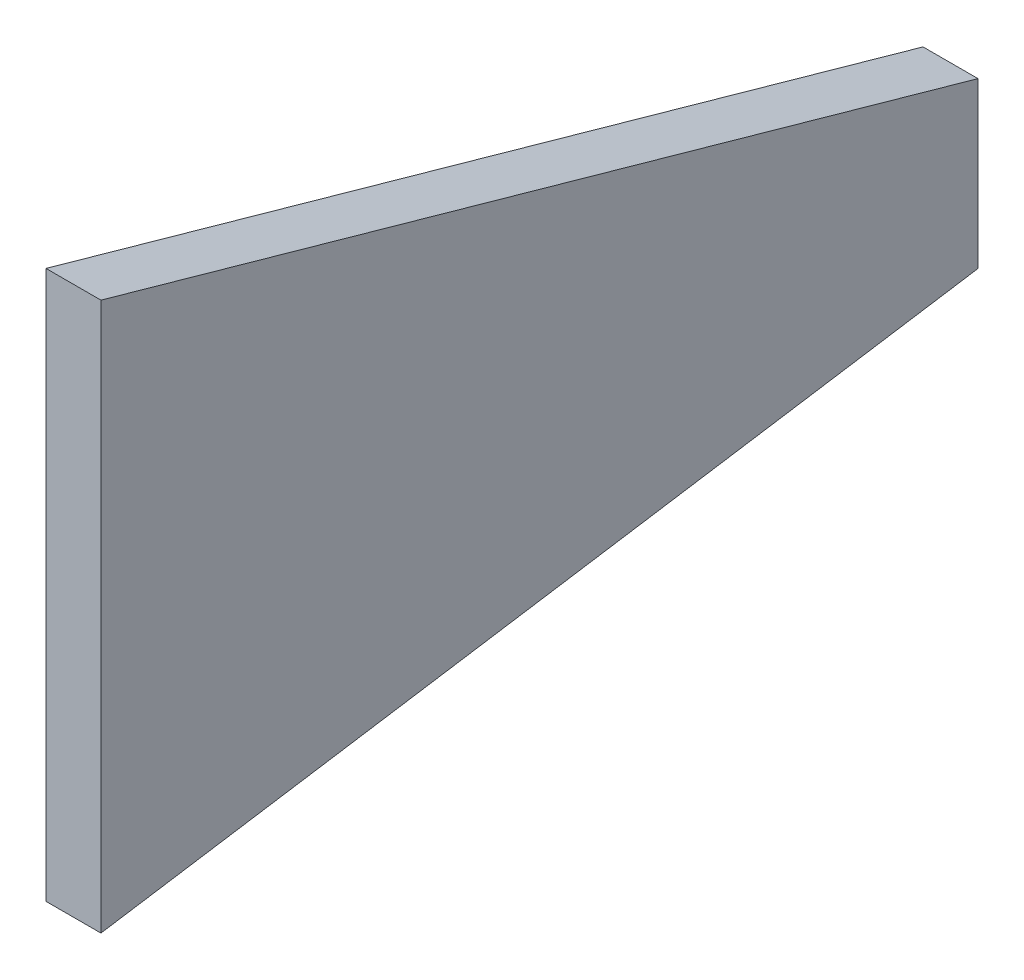
ISO-10303-21;
HEADER;
FILE_DESCRIPTION(('STEP AP214'),'2;1');
FILE_NAME('part.step','',(''),(''),'','','');
FILE_SCHEMA(('AUTOMOTIVE_DESIGN { 1 0 10303 214 1 1 1 1 }'));
ENDSEC;
DATA;
#1=APPLICATION_CONTEXT('core data for automotive mechanical design processes');
#2=APPLICATION_PROTOCOL_DEFINITION('international standard','automotive_design',2000,#1);
#3=PRODUCT_CONTEXT('',#1,'mechanical');
#4=PRODUCT('Part','Part','',(#3));
#5=PRODUCT_RELATED_PRODUCT_CATEGORY('part','',(#4));
#6=PRODUCT_DEFINITION_FORMATION('','',#4);
#7=PRODUCT_DEFINITION_CONTEXT('part definition',#1,'design');
#8=PRODUCT_DEFINITION('design','',#6,#7);
#9=PRODUCT_DEFINITION_SHAPE('','',#8);
#10=(LENGTH_UNIT() NAMED_UNIT(*) SI_UNIT(.MILLI.,.METRE.));
#11=(NAMED_UNIT(*) PLANE_ANGLE_UNIT() SI_UNIT($,.RADIAN.));
#12=(NAMED_UNIT(*) SI_UNIT($,.STERADIAN.) SOLID_ANGLE_UNIT());
#13=UNCERTAINTY_MEASURE_WITH_UNIT(LENGTH_MEASURE(1.E-05),#10,'distance_accuracy_value','');
#14=(GEOMETRIC_REPRESENTATION_CONTEXT(3) GLOBAL_UNCERTAINTY_ASSIGNED_CONTEXT((#13)) GLOBAL_UNIT_ASSIGNED_CONTEXT((#10,
#11,#12)) REPRESENTATION_CONTEXT('',''));
#15=CARTESIAN_POINT('',(0.,0.,0.));
#16=DIRECTION('',(0.,0.,1.));
#17=DIRECTION('',(1.,0.,0.));
#18=AXIS2_PLACEMENT_3D('',#15,#16,#17);
#19=CARTESIAN_POINT('',(-10.,100.,150.));
#20=DIRECTION('',(-0.997785157856609,0.,-0.0665190105237739));
#21=DIRECTION('',(-0.0665190105237739,0.,0.997785157856609));
#22=AXIS2_PLACEMENT_3D('',#19,#20,#21);
#23=PLANE('',#22);
#24=DIRECTION('',(0.0647863548391736,-0.226752241937113,-0.971795322587604));
#25=VECTOR('',#24,1.);
#26=CARTESIAN_POINT('',(-10.,100.,150.));
#27=LINE('',#26,#25);
#28=CARTESIAN_POINT('',(-9.99999999999999,100.,149.999999999997));
#29=VERTEX_POINT('',#28);
#30=CARTESIAN_POINT('',(0.,64.9999999999992,0.));
#31=VERTEX_POINT('',#30);
#32=EDGE_CURVE('E74',#29,#31,#27,.T.);
#33=ORIENTED_EDGE('',*,*,#32,.F.);
#34=DIRECTION('',(0.,-1.,0.));
#35=VECTOR('',#34,1.);
#36=CARTESIAN_POINT('',(-10.,100.,150.));
#37=LINE('',#36,#35);
#38=CARTESIAN_POINT('',(-10.,0.,150.));
#39=VERTEX_POINT('',#38);
#40=EDGE_CURVE('E11',#29,#39,#37,.T.);
#41=ORIENTED_EDGE('',*,*,#40,.T.);
#42=DIRECTION('',(0.0647863548391737,0.226752241937108,-0.971795322587605));
#43=VECTOR('',#42,1.);
#44=CARTESIAN_POINT('',(-8.53095487932844,5.1416579223505,127.964323189927));
#45=LINE('',#44,#43);
#46=CARTESIAN_POINT('',(0.,35.,0.));
#47=VERTEX_POINT('',#46);
#48=EDGE_CURVE('E96',#39,#47,#45,.T.);
#49=ORIENTED_EDGE('',*,*,#48,.T.);
#50=DIRECTION('',(0.,-1.,0.));
#51=VECTOR('',#50,1.);
#52=CARTESIAN_POINT('',(0.,100.,0.));
#53=LINE('',#52,#51);
#54=EDGE_CURVE('E48',#31,#47,#53,.T.);
#55=ORIENTED_EDGE('',*,*,#54,.F.);
#56=EDGE_LOOP('',(#33,#41,#49,#55));
#57=FACE_BOUND('',#56,.T.);
#58=ADVANCED_FACE('F39',(#57),#23,.F.);
#59=CARTESIAN_POINT('',(0.,100.,0.));
#60=DIRECTION('',(0.,0.,1.));
#61=DIRECTION('',(1.,0.,0.));
#62=AXIS2_PLACEMENT_3D('',#59,#60,#61);
#63=PLANE('',#62);
#64=DIRECTION('',(1.,0.,0.));
#65=VECTOR('',#64,1.);
#66=CARTESIAN_POINT('',(-65.,64.9999999999992,0.));
#67=LINE('',#66,#65);
#68=CARTESIAN_POINT('',(-10.0221975855819,64.9999999999992,0.));
#69=VERTEX_POINT('',#68);
#70=EDGE_CURVE('E77',#69,#31,#67,.T.);
#71=ORIENTED_EDGE('',*,*,#70,.T.);
#72=ORIENTED_EDGE('',*,*,#54,.T.);
#73=DIRECTION('',(1.,0.,0.));
#74=VECTOR('',#73,1.);
#75=CARTESIAN_POINT('',(-65.,35.,0.));
#76=LINE('',#75,#74);
#77=CARTESIAN_POINT('',(-10.0221975855819,35.,0.));
#78=VERTEX_POINT('',#77);
#79=EDGE_CURVE('E93',#78,#47,#76,.T.);
#80=ORIENTED_EDGE('',*,*,#79,.F.);
#81=DIRECTION('',(0.,-1.,0.));
#82=VECTOR('',#81,1.);
#83=CARTESIAN_POINT('',(-10.0221975855819,100.,0.));
#84=LINE('',#83,#82);
#85=EDGE_CURVE('E91',#69,#78,#84,.T.);
#86=ORIENTED_EDGE('',*,*,#85,.F.);
#87=EDGE_LOOP('',(#71,#72,#80,#86));
#88=FACE_BOUND('',#87,.T.);
#89=ADVANCED_FACE('F88',(#88),#63,.F.);
#90=CARTESIAN_POINT('',(-10.0221975855819,100.,0.));
#91=DIRECTION('',(0.997785157856609,0.,0.0665190105237738));
#92=DIRECTION('',(0.0665190105237738,0.,-0.997785157856609));
#93=AXIS2_PLACEMENT_3D('',#90,#91,#92);
#94=PLANE('',#93);
#95=DIRECTION('',(-0.0647863548391735,0.226752241937113,0.971795322587604));
#96=VECTOR('',#95,1.);
#97=CARTESIAN_POINT('',(-10.536363377817,66.7995802728227,7.71248688352587));
#98=LINE('',#97,#96);
#99=CARTESIAN_POINT('',(-20.0221975855819,100.,150.));
#100=VERTEX_POINT('',#99);
#101=EDGE_CURVE('E54',#69,#100,#98,.T.);
#102=ORIENTED_EDGE('',*,*,#101,.F.);
#103=ORIENTED_EDGE('',*,*,#85,.T.);
#104=DIRECTION('',(-0.0647863548391736,-0.226752241937108,0.971795322587605));
#105=VECTOR('',#104,1.);
#106=CARTESIAN_POINT('',(-9.06731825714538,38.3420776495278,-14.3231899265478));
#107=LINE('',#106,#105);
#108=CARTESIAN_POINT('',(-20.0221975855819,0.,150.));
#109=VERTEX_POINT('',#108);
#110=EDGE_CURVE('E92',#78,#109,#107,.T.);
#111=ORIENTED_EDGE('',*,*,#110,.T.);
#112=DIRECTION('',(0.,-1.,0.));
#113=VECTOR('',#112,1.);
#114=CARTESIAN_POINT('',(-20.0221975855819,100.,150.));
#115=LINE('',#114,#113);
#116=EDGE_CURVE('E97',#100,#109,#115,.T.);
#117=ORIENTED_EDGE('',*,*,#116,.F.);
#118=EDGE_LOOP('',(#102,#103,#111,#117));
#119=FACE_BOUND('',#118,.T.);
#120=ADVANCED_FACE('F112',(#119),#94,.F.);
#121=CARTESIAN_POINT('',(-20.0221975855819,100.,150.));
#122=DIRECTION('',(0.,0.,-1.));
#123=DIRECTION('',(-1.,0.,0.));
#124=AXIS2_PLACEMENT_3D('',#121,#122,#123);
#125=PLANE('',#124);
#126=DIRECTION('',(1.,0.,0.));
#127=VECTOR('',#126,1.);
#128=CARTESIAN_POINT('',(-20.0221975855819,0.,150.));
#129=LINE('',#128,#127);
#130=EDGE_CURVE('E83',#109,#39,#129,.T.);
#131=ORIENTED_EDGE('',*,*,#130,.T.);
#132=ORIENTED_EDGE('',*,*,#40,.F.);
#133=DIRECTION('',(1.,0.,0.));
#134=VECTOR('',#133,1.);
#135=CARTESIAN_POINT('',(-20.0221975855819,100.,150.));
#136=LINE('',#135,#134);
#137=EDGE_CURVE('E79',#100,#29,#136,.T.);
#138=ORIENTED_EDGE('',*,*,#137,.F.);
#139=ORIENTED_EDGE('',*,*,#116,.T.);
#140=EDGE_LOOP('',(#131,#132,#138,#139));
#141=FACE_BOUND('',#140,.T.);
#142=ADVANCED_FACE('F41',(#141),#125,.F.);
#143=CARTESIAN_POINT('',(-65.,33.1928345626976,7.74499473129611));
#144=DIRECTION('',(0.,0.973841209741793,0.227229615606419));
#145=DIRECTION('',(0.,-0.227229615606419,0.973841209741793));
#146=AXIS2_PLACEMENT_3D('',#143,#144,#145);
#147=PLANE('',#146);
#148=ORIENTED_EDGE('',*,*,#130,.F.);
#149=ORIENTED_EDGE('',*,*,#110,.F.);
#150=ORIENTED_EDGE('',*,*,#79,.T.);
#151=ORIENTED_EDGE('',*,*,#48,.F.);
#152=EDGE_LOOP('',(#148,#149,#150,#151));
#153=FACE_BOUND('',#152,.T.);
#154=ADVANCED_FACE('F110',(#153),#147,.F.);
#155=CARTESIAN_POINT('',(-65.,61.6438356164382,-14.3835616438359));
#156=DIRECTION('',(0.,0.973841209741792,-0.227229615606423));
#157=DIRECTION('',(0.,0.227229615606423,0.973841209741792));
#158=AXIS2_PLACEMENT_3D('',#155,#156,#157);
#159=PLANE('',#158);
#160=ORIENTED_EDGE('',*,*,#32,.T.);
#161=ORIENTED_EDGE('',*,*,#70,.F.);
#162=ORIENTED_EDGE('',*,*,#101,.T.);
#163=ORIENTED_EDGE('',*,*,#137,.T.);
#164=EDGE_LOOP('',(#160,#161,#162,#163));
#165=FACE_BOUND('',#164,.T.);
#166=ADVANCED_FACE('F76',(#165),#159,.T.);
#167=CLOSED_SHELL('',(#58,#89,#120,#142,#154,#166));
#168=MANIFOLD_SOLID_BREP('B2',#167);
#169=ADVANCED_BREP_SHAPE_REPRESENTATION('',(#18,#168),#14);
#170=SHAPE_DEFINITION_REPRESENTATION(#9,#169);
ENDSEC;
END-ISO-10303-21;
